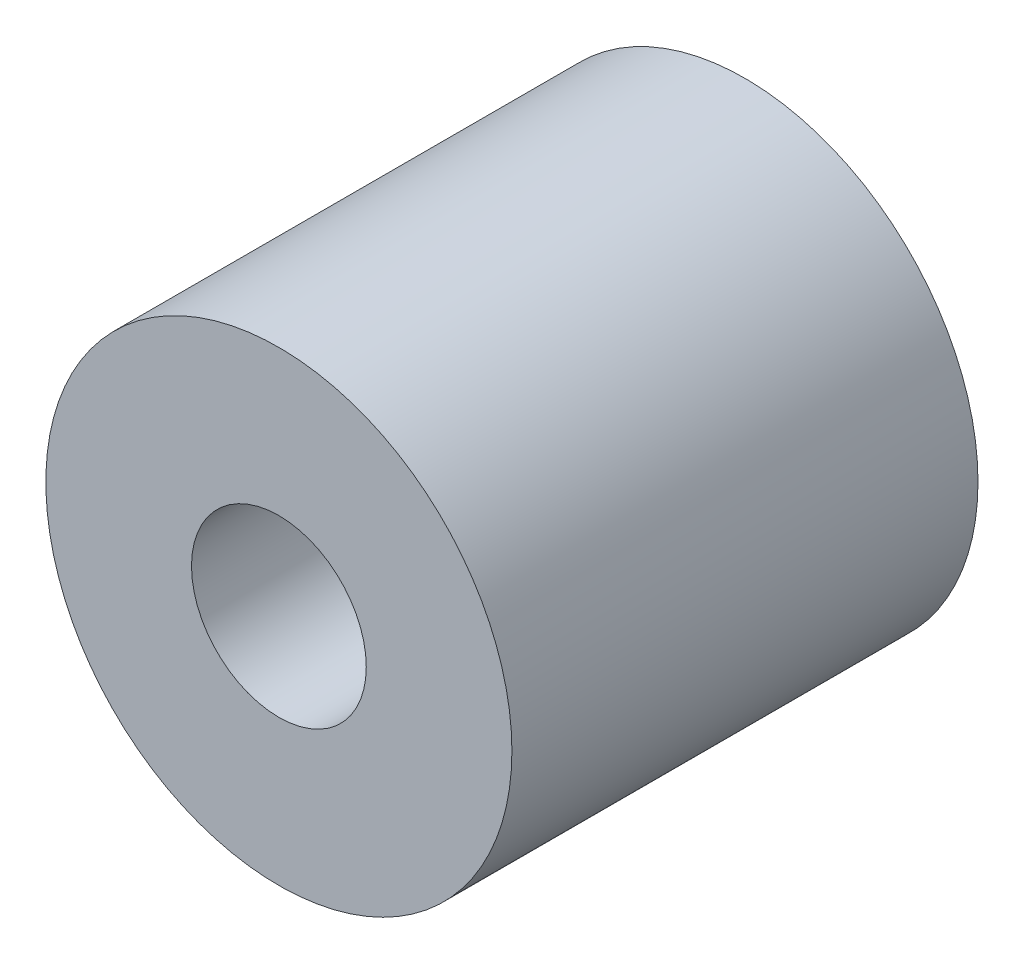
ISO-10303-21;
HEADER;
FILE_DESCRIPTION(('STEP AP214'),'2;1');
FILE_NAME('part.step','',(''),(''),'','','');
FILE_SCHEMA(('AUTOMOTIVE_DESIGN { 1 0 10303 214 1 1 1 1 }'));
ENDSEC;
DATA;
#1=APPLICATION_CONTEXT('core data for automotive mechanical design processes');
#2=APPLICATION_PROTOCOL_DEFINITION('international standard','automotive_design',2000,#1);
#3=PRODUCT_CONTEXT('',#1,'mechanical');
#4=PRODUCT('Part','Part','',(#3));
#5=PRODUCT_RELATED_PRODUCT_CATEGORY('part','',(#4));
#6=PRODUCT_DEFINITION_FORMATION('','',#4);
#7=PRODUCT_DEFINITION_CONTEXT('part definition',#1,'design');
#8=PRODUCT_DEFINITION('design','',#6,#7);
#9=PRODUCT_DEFINITION_SHAPE('','',#8);
#10=(LENGTH_UNIT() NAMED_UNIT(*) SI_UNIT(.MILLI.,.METRE.));
#11=(NAMED_UNIT(*) PLANE_ANGLE_UNIT() SI_UNIT($,.RADIAN.));
#12=(NAMED_UNIT(*) SI_UNIT($,.STERADIAN.) SOLID_ANGLE_UNIT());
#13=UNCERTAINTY_MEASURE_WITH_UNIT(LENGTH_MEASURE(1.E-05),#10,'distance_accuracy_value','');
#14=(GEOMETRIC_REPRESENTATION_CONTEXT(3) GLOBAL_UNCERTAINTY_ASSIGNED_CONTEXT((#13)) GLOBAL_UNIT_ASSIGNED_CONTEXT((#10,
#11,#12)) REPRESENTATION_CONTEXT('',''));
#15=CARTESIAN_POINT('',(0.,0.,0.));
#16=DIRECTION('',(0.,0.,1.));
#17=DIRECTION('',(1.,0.,0.));
#18=AXIS2_PLACEMENT_3D('',#15,#16,#17);
#19=CARTESIAN_POINT('',(0.,0.,8.));
#20=DIRECTION('',(0.,0.,-1.));
#21=DIRECTION('',(-1.,0.,0.));
#22=AXIS2_PLACEMENT_3D('',#19,#20,#21);
#23=CYLINDRICAL_SURFACE('',#22,3.075);
#24=CARTESIAN_POINT('',(0.,0.,0.));
#25=DIRECTION('',(0.,0.,1.));
#26=DIRECTION('',(1.,0.,0.));
#27=AXIS2_PLACEMENT_3D('',#24,#25,#26);
#28=CIRCLE('',#27,3.075);
#29=CARTESIAN_POINT('',(3.075,0.,0.));
#30=VERTEX_POINT('',#29);
#31=EDGE_CURVE('E45',#30,#30,#28,.T.);
#32=ORIENTED_EDGE('',*,*,#31,.F.);
#33=EDGE_LOOP('',(#32));
#34=FACE_BOUND('',#33,.T.);
#35=CARTESIAN_POINT('',(0.,0.,2.5));
#36=DIRECTION('',(0.,0.,1.));
#37=DIRECTION('',(1.,0.,0.));
#38=AXIS2_PLACEMENT_3D('',#35,#36,#37);
#39=CIRCLE('',#38,3.075);
#40=CARTESIAN_POINT('',(3.075,0.,2.5));
#41=VERTEX_POINT('',#40);
#42=EDGE_CURVE('E52',#41,#41,#39,.F.);
#43=ORIENTED_EDGE('',*,*,#42,.F.);
#44=EDGE_LOOP('',(#43));
#45=FACE_BOUND('',#44,.T.);
#46=ADVANCED_FACE('F34',(#34,#45),#23,.F.);
#47=CARTESIAN_POINT('',(0.,0.,8.));
#48=DIRECTION('',(0.,0.,1.));
#49=DIRECTION('',(1.,0.,0.));
#50=AXIS2_PLACEMENT_3D('',#47,#48,#49);
#51=PLANE('',#50);
#52=CARTESIAN_POINT('',(0.,0.,8.));
#53=DIRECTION('',(0.,0.,1.));
#54=DIRECTION('',(1.,0.,0.));
#55=AXIS2_PLACEMENT_3D('',#52,#53,#54);
#56=CIRCLE('',#55,4.);
#57=CARTESIAN_POINT('',(4.,0.,8.));
#58=VERTEX_POINT('',#57);
#59=EDGE_CURVE('E11',#58,#58,#56,.T.);
#60=ORIENTED_EDGE('',*,*,#59,.T.);
#61=EDGE_LOOP('',(#60));
#62=FACE_BOUND('',#61,.T.);
#63=CARTESIAN_POINT('',(0.,0.,8.));
#64=DIRECTION('',(0.,0.,1.));
#65=DIRECTION('',(1.,0.,0.));
#66=AXIS2_PLACEMENT_3D('',#63,#64,#65);
#67=CIRCLE('',#66,1.5);
#68=CARTESIAN_POINT('',(1.5,0.,8.));
#69=VERTEX_POINT('',#68);
#70=EDGE_CURVE('E53',#69,#69,#67,.T.);
#71=ORIENTED_EDGE('',*,*,#70,.F.);
#72=EDGE_LOOP('',(#71));
#73=FACE_BOUND('',#72,.T.);
#74=ADVANCED_FACE('F63',(#62,#73),#51,.T.);
#75=CARTESIAN_POINT('',(0.,0.,0.));
#76=DIRECTION('',(0.,0.,1.));
#77=DIRECTION('',(1.,0.,0.));
#78=AXIS2_PLACEMENT_3D('',#75,#76,#77);
#79=PLANE('',#78);
#80=CARTESIAN_POINT('',(0.,0.,0.));
#81=DIRECTION('',(0.,0.,1.));
#82=DIRECTION('',(1.,0.,0.));
#83=AXIS2_PLACEMENT_3D('',#80,#81,#82);
#84=CIRCLE('',#83,4.);
#85=CARTESIAN_POINT('',(4.,0.,0.));
#86=VERTEX_POINT('',#85);
#87=EDGE_CURVE('E38',#86,#86,#84,.T.);
#88=ORIENTED_EDGE('',*,*,#87,.F.);
#89=EDGE_LOOP('',(#88));
#90=FACE_BOUND('',#89,.T.);
#91=ORIENTED_EDGE('',*,*,#31,.T.);
#92=EDGE_LOOP('',(#91));
#93=FACE_BOUND('',#92,.T.);
#94=ADVANCED_FACE('F69',(#90,#93),#79,.F.);
#95=CARTESIAN_POINT('',(0.,0.,8.));
#96=DIRECTION('',(0.,0.,-1.));
#97=DIRECTION('',(-1.,0.,0.));
#98=AXIS2_PLACEMENT_3D('',#95,#96,#97);
#99=CYLINDRICAL_SURFACE('',#98,4.);
#100=ORIENTED_EDGE('',*,*,#59,.F.);
#101=EDGE_LOOP('',(#100));
#102=FACE_BOUND('',#101,.T.);
#103=ORIENTED_EDGE('',*,*,#87,.T.);
#104=EDGE_LOOP('',(#103));
#105=FACE_BOUND('',#104,.T.);
#106=ADVANCED_FACE('F36',(#102,#105),#99,.T.);
#107=CARTESIAN_POINT('',(0.,0.,-8.69741340859454));
#108=DIRECTION('',(0.,0.,1.));
#109=DIRECTION('',(1.,0.,0.));
#110=AXIS2_PLACEMENT_3D('',#107,#108,#109);
#111=CYLINDRICAL_SURFACE('',#110,1.5);
#112=CARTESIAN_POINT('',(0.,0.,2.5));
#113=DIRECTION('',(0.,0.,1.));
#114=DIRECTION('',(1.,0.,0.));
#115=AXIS2_PLACEMENT_3D('',#112,#113,#114);
#116=CIRCLE('',#115,1.5);
#117=CARTESIAN_POINT('',(1.5,0.,2.5));
#118=VERTEX_POINT('',#117);
#119=EDGE_CURVE('E49',#118,#118,#116,.F.);
#120=ORIENTED_EDGE('',*,*,#119,.T.);
#121=EDGE_LOOP('',(#120));
#122=FACE_BOUND('',#121,.T.);
#123=ORIENTED_EDGE('',*,*,#70,.T.);
#124=EDGE_LOOP('',(#123));
#125=FACE_BOUND('',#124,.T.);
#126=ADVANCED_FACE('F73',(#122,#125),#111,.F.);
#127=CARTESIAN_POINT('',(0.,0.,2.5));
#128=DIRECTION('',(0.,0.,1.));
#129=DIRECTION('',(1.,0.,0.));
#130=AXIS2_PLACEMENT_3D('',#127,#128,#129);
#131=PLANE('',#130);
#132=ORIENTED_EDGE('',*,*,#42,.T.);
#133=EDGE_LOOP('',(#132));
#134=FACE_BOUND('',#133,.T.);
#135=ORIENTED_EDGE('',*,*,#119,.F.);
#136=EDGE_LOOP('',(#135));
#137=FACE_BOUND('',#136,.T.);
#138=ADVANCED_FACE('F59',(#134,#137),#131,.F.);
#139=CLOSED_SHELL('',(#46,#74,#94,#106,#126,#138));
#140=MANIFOLD_SOLID_BREP('B2',#139);
#141=ADVANCED_BREP_SHAPE_REPRESENTATION('',(#18,#140),#14);
#142=SHAPE_DEFINITION_REPRESENTATION(#9,#141);
ENDSEC;
END-ISO-10303-21;
